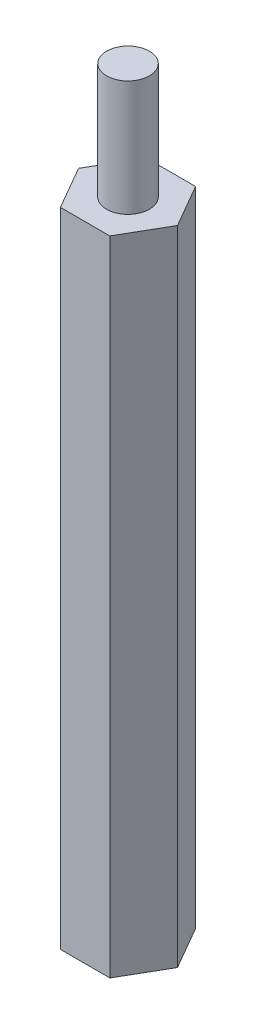
ISO-10303-21;
HEADER;
FILE_DESCRIPTION(('STEP AP214'),'2;1');
FILE_NAME('part.step','',(''),(''),'','','');
FILE_SCHEMA(('AUTOMOTIVE_DESIGN { 1 0 10303 214 1 1 1 1 }'));
ENDSEC;
DATA;
#1=APPLICATION_CONTEXT('core data for automotive mechanical design processes');
#2=APPLICATION_PROTOCOL_DEFINITION('international standard','automotive_design',2000,#1);
#3=PRODUCT_CONTEXT('',#1,'mechanical');
#4=PRODUCT('Part','Part','',(#3));
#5=PRODUCT_RELATED_PRODUCT_CATEGORY('part','',(#4));
#6=PRODUCT_DEFINITION_FORMATION('','',#4);
#7=PRODUCT_DEFINITION_CONTEXT('part definition',#1,'design');
#8=PRODUCT_DEFINITION('design','',#6,#7);
#9=PRODUCT_DEFINITION_SHAPE('','',#8);
#10=(LENGTH_UNIT() NAMED_UNIT(*) SI_UNIT(.MILLI.,.METRE.));
#11=(NAMED_UNIT(*) PLANE_ANGLE_UNIT() SI_UNIT($,.RADIAN.));
#12=(NAMED_UNIT(*) SI_UNIT($,.STERADIAN.) SOLID_ANGLE_UNIT());
#13=UNCERTAINTY_MEASURE_WITH_UNIT(LENGTH_MEASURE(1.E-05),#10,'distance_accuracy_value','');
#14=(GEOMETRIC_REPRESENTATION_CONTEXT(3) GLOBAL_UNCERTAINTY_ASSIGNED_CONTEXT((#13)) GLOBAL_UNIT_ASSIGNED_CONTEXT((#10,
#11,#12)) REPRESENTATION_CONTEXT('',''));
#15=CARTESIAN_POINT('',(0.,0.,0.));
#16=DIRECTION('',(0.,0.,1.));
#17=DIRECTION('',(1.,0.,0.));
#18=AXIS2_PLACEMENT_3D('',#15,#16,#17);
#19=CARTESIAN_POINT('',(-1.73205080756888,45.,-3.));
#20=DIRECTION('',(0.866025403784439,0.,0.5));
#21=DIRECTION('',(0.5,0.,-0.866025403784439));
#22=AXIS2_PLACEMENT_3D('',#19,#20,#21);
#23=PLANE('',#22);
#24=DIRECTION('',(-0.5,0.,0.866025403784439));
#25=VECTOR('',#24,1.);
#26=CARTESIAN_POINT('',(-1.73205080756888,0.,-3.));
#27=LINE('',#26,#25);
#28=CARTESIAN_POINT('',(-1.73205080756888,0.,-3.));
#29=VERTEX_POINT('',#28);
#30=CARTESIAN_POINT('',(-3.46410161513775,0.,0.));
#31=VERTEX_POINT('',#30);
#32=EDGE_CURVE('E123',#29,#31,#27,.T.);
#33=ORIENTED_EDGE('',*,*,#32,.T.);
#34=DIRECTION('',(0.,-1.,0.));
#35=VECTOR('',#34,1.);
#36=CARTESIAN_POINT('',(-3.46410161513775,45.,0.));
#37=LINE('',#36,#35);
#38=CARTESIAN_POINT('',(-3.46410161513775,45.,0.));
#39=VERTEX_POINT('',#38);
#40=EDGE_CURVE('E40',#39,#31,#37,.T.);
#41=ORIENTED_EDGE('',*,*,#40,.F.);
#42=DIRECTION('',(-0.5,0.,0.866025403784439));
#43=VECTOR('',#42,1.);
#44=CARTESIAN_POINT('',(-1.73205080756888,45.,-3.));
#45=LINE('',#44,#43);
#46=CARTESIAN_POINT('',(-1.73205080756888,45.,-3.));
#47=VERTEX_POINT('',#46);
#48=EDGE_CURVE('E134',#47,#39,#45,.T.);
#49=ORIENTED_EDGE('',*,*,#48,.F.);
#50=DIRECTION('',(0.,-1.,0.));
#51=VECTOR('',#50,1.);
#52=CARTESIAN_POINT('',(-1.73205080756888,45.,-3.));
#53=LINE('',#52,#51);
#54=EDGE_CURVE('E119',#47,#29,#53,.T.);
#55=ORIENTED_EDGE('',*,*,#54,.T.);
#56=EDGE_LOOP('',(#33,#41,#49,#55));
#57=FACE_BOUND('',#56,.T.);
#58=ADVANCED_FACE('F37',(#57),#23,.F.);
#59=CARTESIAN_POINT('',(-3.46410161513775,45.,0.));
#60=DIRECTION('',(0.866025403784439,0.,-0.5));
#61=DIRECTION('',(-0.5,0.,-0.866025403784439));
#62=AXIS2_PLACEMENT_3D('',#59,#60,#61);
#63=PLANE('',#62);
#64=DIRECTION('',(0.5,0.,0.866025403784439));
#65=VECTOR('',#64,1.);
#66=CARTESIAN_POINT('',(-3.46410161513775,0.,0.));
#67=LINE('',#66,#65);
#68=CARTESIAN_POINT('',(-1.73205080756888,0.,3.));
#69=VERTEX_POINT('',#68);
#70=EDGE_CURVE('E126',#31,#69,#67,.T.);
#71=ORIENTED_EDGE('',*,*,#70,.T.);
#72=DIRECTION('',(0.,-1.,0.));
#73=VECTOR('',#72,1.);
#74=CARTESIAN_POINT('',(-1.73205080756888,45.,3.));
#75=LINE('',#74,#73);
#76=CARTESIAN_POINT('',(-1.73205080756888,45.,3.));
#77=VERTEX_POINT('',#76);
#78=EDGE_CURVE('E137',#77,#69,#75,.T.);
#79=ORIENTED_EDGE('',*,*,#78,.F.);
#80=DIRECTION('',(0.5,0.,0.866025403784439));
#81=VECTOR('',#80,1.);
#82=CARTESIAN_POINT('',(-3.46410161513775,45.,0.));
#83=LINE('',#82,#81);
#84=EDGE_CURVE('E92',#39,#77,#83,.T.);
#85=ORIENTED_EDGE('',*,*,#84,.F.);
#86=ORIENTED_EDGE('',*,*,#40,.T.);
#87=EDGE_LOOP('',(#71,#79,#85,#86));
#88=FACE_BOUND('',#87,.T.);
#89=ADVANCED_FACE('F142',(#88),#63,.F.);
#90=CARTESIAN_POINT('',(-1.73205080756888,45.,3.));
#91=DIRECTION('',(0.,0.,-1.));
#92=DIRECTION('',(-1.,0.,0.));
#93=AXIS2_PLACEMENT_3D('',#90,#91,#92);
#94=PLANE('',#93);
#95=DIRECTION('',(1.,0.,0.));
#96=VECTOR('',#95,1.);
#97=CARTESIAN_POINT('',(-1.73205080756888,0.,3.));
#98=LINE('',#97,#96);
#99=CARTESIAN_POINT('',(1.73205080756888,0.,3.));
#100=VERTEX_POINT('',#99);
#101=EDGE_CURVE('E129',#69,#100,#98,.T.);
#102=ORIENTED_EDGE('',*,*,#101,.T.);
#103=DIRECTION('',(0.,-1.,0.));
#104=VECTOR('',#103,1.);
#105=CARTESIAN_POINT('',(1.73205080756888,45.,3.));
#106=LINE('',#105,#104);
#107=CARTESIAN_POINT('',(1.73205080756888,45.,3.));
#108=VERTEX_POINT('',#107);
#109=EDGE_CURVE('E114',#108,#100,#106,.T.);
#110=ORIENTED_EDGE('',*,*,#109,.F.);
#111=DIRECTION('',(1.,0.,0.));
#112=VECTOR('',#111,1.);
#113=CARTESIAN_POINT('',(-1.73205080756888,45.,3.));
#114=LINE('',#113,#112);
#115=EDGE_CURVE('E105',#77,#108,#114,.T.);
#116=ORIENTED_EDGE('',*,*,#115,.F.);
#117=ORIENTED_EDGE('',*,*,#78,.T.);
#118=EDGE_LOOP('',(#102,#110,#116,#117));
#119=FACE_BOUND('',#118,.T.);
#120=ADVANCED_FACE('F148',(#119),#94,.F.);
#121=CARTESIAN_POINT('',(1.73205080756888,45.,3.));
#122=DIRECTION('',(-0.866025403784439,0.,-0.5));
#123=DIRECTION('',(-0.5,0.,0.866025403784439));
#124=AXIS2_PLACEMENT_3D('',#121,#122,#123);
#125=PLANE('',#124);
#126=DIRECTION('',(0.5,0.,-0.866025403784439));
#127=VECTOR('',#126,1.);
#128=CARTESIAN_POINT('',(1.73205080756888,0.,3.));
#129=LINE('',#128,#127);
#130=CARTESIAN_POINT('',(3.46410161513775,0.,0.));
#131=VERTEX_POINT('',#130);
#132=EDGE_CURVE('E113',#100,#131,#129,.T.);
#133=ORIENTED_EDGE('',*,*,#132,.T.);
#134=DIRECTION('',(0.,-1.,0.));
#135=VECTOR('',#134,1.);
#136=CARTESIAN_POINT('',(3.46410161513775,45.,0.));
#137=LINE('',#136,#135);
#138=CARTESIAN_POINT('',(3.46410161513775,45.,0.));
#139=VERTEX_POINT('',#138);
#140=EDGE_CURVE('E110',#139,#131,#137,.T.);
#141=ORIENTED_EDGE('',*,*,#140,.F.);
#142=DIRECTION('',(0.5,0.,-0.866025403784439));
#143=VECTOR('',#142,1.);
#144=CARTESIAN_POINT('',(1.73205080756888,45.,3.));
#145=LINE('',#144,#143);
#146=EDGE_CURVE('E99',#108,#139,#145,.T.);
#147=ORIENTED_EDGE('',*,*,#146,.F.);
#148=ORIENTED_EDGE('',*,*,#109,.T.);
#149=EDGE_LOOP('',(#133,#141,#147,#148));
#150=FACE_BOUND('',#149,.T.);
#151=ADVANCED_FACE('F111',(#150),#125,.F.);
#152=CARTESIAN_POINT('',(3.46410161513775,45.,0.));
#153=DIRECTION('',(-0.866025403784439,0.,0.5));
#154=DIRECTION('',(0.5,0.,0.866025403784439));
#155=AXIS2_PLACEMENT_3D('',#152,#153,#154);
#156=PLANE('',#155);
#157=DIRECTION('',(-0.5,0.,-0.866025403784439));
#158=VECTOR('',#157,1.);
#159=CARTESIAN_POINT('',(3.46410161513775,0.,0.));
#160=LINE('',#159,#158);
#161=CARTESIAN_POINT('',(1.73205080756888,0.,-3.));
#162=VERTEX_POINT('',#161);
#163=EDGE_CURVE('E77',#131,#162,#160,.T.);
#164=ORIENTED_EDGE('',*,*,#163,.T.);
#165=DIRECTION('',(0.,-1.,0.));
#166=VECTOR('',#165,1.);
#167=CARTESIAN_POINT('',(1.73205080756888,45.,-3.));
#168=LINE('',#167,#166);
#169=CARTESIAN_POINT('',(1.73205080756888,45.,-3.));
#170=VERTEX_POINT('',#169);
#171=EDGE_CURVE('E115',#170,#162,#168,.T.);
#172=ORIENTED_EDGE('',*,*,#171,.F.);
#173=DIRECTION('',(-0.5,0.,-0.866025403784439));
#174=VECTOR('',#173,1.);
#175=CARTESIAN_POINT('',(3.46410161513775,45.,0.));
#176=LINE('',#175,#174);
#177=EDGE_CURVE('E103',#139,#170,#176,.T.);
#178=ORIENTED_EDGE('',*,*,#177,.F.);
#179=ORIENTED_EDGE('',*,*,#140,.T.);
#180=EDGE_LOOP('',(#164,#172,#178,#179));
#181=FACE_BOUND('',#180,.T.);
#182=ADVANCED_FACE('F117',(#181),#156,.F.);
#183=CARTESIAN_POINT('',(1.73205080756888,45.,-3.));
#184=DIRECTION('',(0.,0.,1.));
#185=DIRECTION('',(1.,0.,0.));
#186=AXIS2_PLACEMENT_3D('',#183,#184,#185);
#187=PLANE('',#186);
#188=DIRECTION('',(-1.,0.,0.));
#189=VECTOR('',#188,1.);
#190=CARTESIAN_POINT('',(1.73205080756888,0.,-3.));
#191=LINE('',#190,#189);
#192=EDGE_CURVE('E83',#162,#29,#191,.T.);
#193=ORIENTED_EDGE('',*,*,#192,.T.);
#194=ORIENTED_EDGE('',*,*,#54,.F.);
#195=DIRECTION('',(-1.,0.,0.));
#196=VECTOR('',#195,1.);
#197=CARTESIAN_POINT('',(1.73205080756888,45.,-3.));
#198=LINE('',#197,#196);
#199=EDGE_CURVE('E54',#170,#47,#198,.T.);
#200=ORIENTED_EDGE('',*,*,#199,.F.);
#201=ORIENTED_EDGE('',*,*,#171,.T.);
#202=EDGE_LOOP('',(#193,#194,#200,#201));
#203=FACE_BOUND('',#202,.T.);
#204=ADVANCED_FACE('F179',(#203),#187,.F.);
#205=CARTESIAN_POINT('',(0.,45.,0.));
#206=DIRECTION('',(0.,1.,0.));
#207=DIRECTION('',(0.,0.,1.));
#208=AXIS2_PLACEMENT_3D('',#205,#206,#207);
#209=PLANE('',#208);
#210=CARTESIAN_POINT('',(0.,45.,0.));
#211=DIRECTION('',(0.,1.,0.));
#212=DIRECTION('',(0.,0.,1.));
#213=AXIS2_PLACEMENT_3D('',#210,#211,#212);
#214=CIRCLE('',#213,1.5);
#215=CARTESIAN_POINT('',(0.,45.,1.5));
#216=VERTEX_POINT('',#215);
#217=EDGE_CURVE('E11',#216,#216,#214,.T.);
#218=ORIENTED_EDGE('',*,*,#217,.F.);
#219=EDGE_LOOP('',(#218));
#220=FACE_BOUND('',#219,.T.);
#221=ORIENTED_EDGE('',*,*,#48,.T.);
#222=ORIENTED_EDGE('',*,*,#84,.T.);
#223=ORIENTED_EDGE('',*,*,#115,.T.);
#224=ORIENTED_EDGE('',*,*,#146,.T.);
#225=ORIENTED_EDGE('',*,*,#177,.T.);
#226=ORIENTED_EDGE('',*,*,#199,.T.);
#227=EDGE_LOOP('',(#221,#222,#223,#224,#225,#226));
#228=FACE_BOUND('',#227,.T.);
#229=ADVANCED_FACE('F101',(#220,#228),#209,.T.);
#230=CARTESIAN_POINT('',(0.,0.,0.));
#231=DIRECTION('',(0.,1.,0.));
#232=DIRECTION('',(0.,0.,1.));
#233=AXIS2_PLACEMENT_3D('',#230,#231,#232);
#234=PLANE('',#233);
#235=CARTESIAN_POINT('',(0.,0.,0.));
#236=DIRECTION('',(0.,-1.,0.));
#237=DIRECTION('',(0.,0.,-1.));
#238=AXIS2_PLACEMENT_3D('',#235,#236,#237);
#239=CIRCLE('',#238,1.5);
#240=CARTESIAN_POINT('',(0.,0.,-1.5));
#241=VERTEX_POINT('',#240);
#242=EDGE_CURVE('E155',#241,#241,#239,.T.);
#243=ORIENTED_EDGE('',*,*,#242,.F.);
#244=EDGE_LOOP('',(#243));
#245=FACE_BOUND('',#244,.T.);
#246=ORIENTED_EDGE('',*,*,#32,.F.);
#247=ORIENTED_EDGE('',*,*,#192,.F.);
#248=ORIENTED_EDGE('',*,*,#163,.F.);
#249=ORIENTED_EDGE('',*,*,#132,.F.);
#250=ORIENTED_EDGE('',*,*,#101,.F.);
#251=ORIENTED_EDGE('',*,*,#70,.F.);
#252=EDGE_LOOP('',(#246,#247,#248,#249,#250,#251));
#253=FACE_BOUND('',#252,.T.);
#254=ADVANCED_FACE('F147',(#245,#253),#234,.F.);
#255=CARTESIAN_POINT('',(0.,53.0916054709663,0.));
#256=DIRECTION('',(0.,-1.,0.));
#257=DIRECTION('',(0.,0.,-1.));
#258=AXIS2_PLACEMENT_3D('',#255,#256,#257);
#259=CYLINDRICAL_SURFACE('',#258,1.5);
#260=CARTESIAN_POINT('',(0.,53.0916054709663,0.));
#261=DIRECTION('',(0.,1.,0.));
#262=DIRECTION('',(0.,0.,1.));
#263=AXIS2_PLACEMENT_3D('',#260,#261,#262);
#264=CIRCLE('',#263,1.5);
#265=CARTESIAN_POINT('',(0.,53.0916054709663,1.5));
#266=VERTEX_POINT('',#265);
#267=EDGE_CURVE('E127',#266,#266,#264,.T.);
#268=ORIENTED_EDGE('',*,*,#267,.F.);
#269=EDGE_LOOP('',(#268));
#270=FACE_BOUND('',#269,.T.);
#271=ORIENTED_EDGE('',*,*,#217,.T.);
#272=EDGE_LOOP('',(#271));
#273=FACE_BOUND('',#272,.T.);
#274=ADVANCED_FACE('F171',(#270,#273),#259,.T.);
#275=CARTESIAN_POINT('',(0.,53.0916054709663,0.));
#276=DIRECTION('',(0.,1.,0.));
#277=DIRECTION('',(0.,0.,1.));
#278=AXIS2_PLACEMENT_3D('',#275,#276,#277);
#279=PLANE('',#278);
#280=ORIENTED_EDGE('',*,*,#267,.T.);
#281=EDGE_LOOP('',(#280));
#282=FACE_BOUND('',#281,.T.);
#283=ADVANCED_FACE('F166',(#282),#279,.T.);
#284=CARTESIAN_POINT('',(0.,4.,0.));
#285=DIRECTION('',(0.,-1.,0.));
#286=DIRECTION('',(0.,0.,-1.));
#287=AXIS2_PLACEMENT_3D('',#284,#285,#286);
#288=CYLINDRICAL_SURFACE('',#287,1.5);
#289=CARTESIAN_POINT('',(0.,4.,0.));
#290=DIRECTION('',(0.,-1.,0.));
#291=DIRECTION('',(0.,0.,-1.));
#292=AXIS2_PLACEMENT_3D('',#289,#290,#291);
#293=CIRCLE('',#292,1.5);
#294=CARTESIAN_POINT('',(0.,4.,-1.5));
#295=VERTEX_POINT('',#294);
#296=EDGE_CURVE('E154',#295,#295,#293,.T.);
#297=ORIENTED_EDGE('',*,*,#296,.F.);
#298=EDGE_LOOP('',(#297));
#299=FACE_BOUND('',#298,.T.);
#300=ORIENTED_EDGE('',*,*,#242,.T.);
#301=EDGE_LOOP('',(#300));
#302=FACE_BOUND('',#301,.T.);
#303=ADVANCED_FACE('F163',(#299,#302),#288,.F.);
#304=CARTESIAN_POINT('',(0.,4.,0.));
#305=DIRECTION('',(0.,-1.,0.));
#306=DIRECTION('',(0.,0.,-1.));
#307=AXIS2_PLACEMENT_3D('',#304,#305,#306);
#308=PLANE('',#307);
#309=ORIENTED_EDGE('',*,*,#296,.T.);
#310=EDGE_LOOP('',(#309));
#311=FACE_BOUND('',#310,.T.);
#312=ADVANCED_FACE('F161',(#311),#308,.T.);
#313=CLOSED_SHELL('',(#58,#89,#120,#151,#182,#204,#229,#254,#274,#283,#303,#312));
#314=MANIFOLD_SOLID_BREP('B2',#313);
#315=ADVANCED_BREP_SHAPE_REPRESENTATION('',(#18,#314),#14);
#316=SHAPE_DEFINITION_REPRESENTATION(#9,#315);
ENDSEC;
END-ISO-10303-21;
